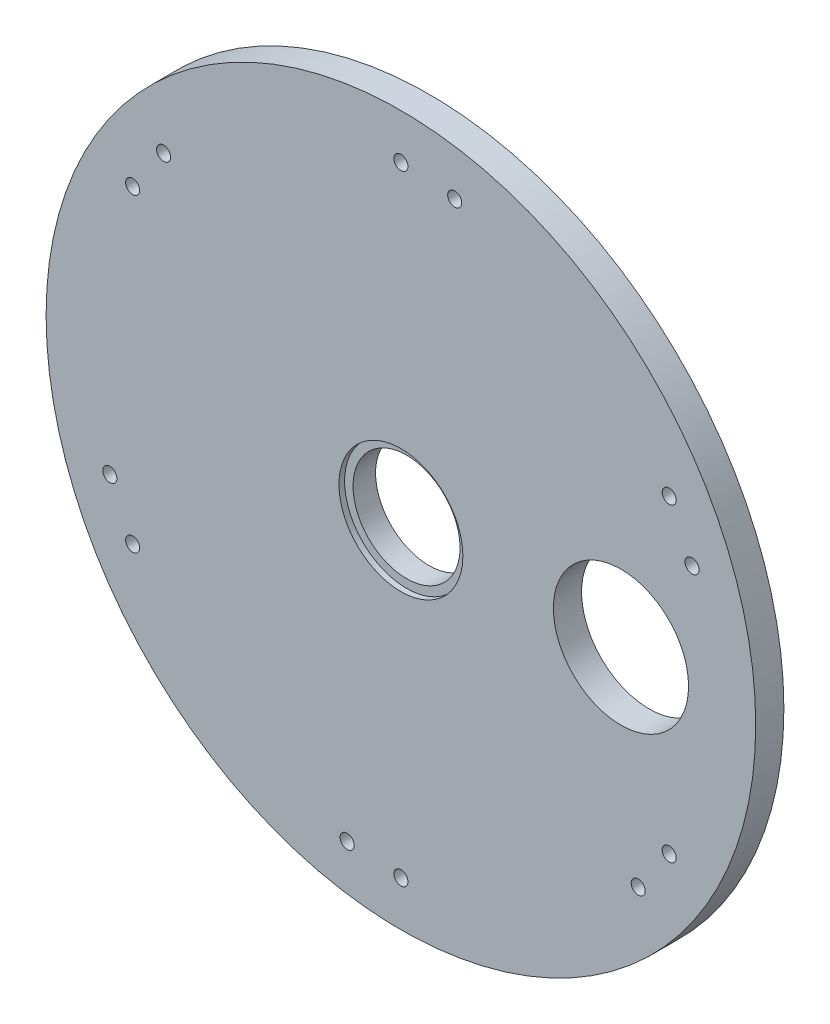
ISO-10303-21;
HEADER;
FILE_DESCRIPTION(('STEP AP214'),'2;1');
FILE_NAME('part.step','',(''),(''),'','','');
FILE_SCHEMA(('AUTOMOTIVE_DESIGN { 1 0 10303 214 1 1 1 1 }'));
ENDSEC;
DATA;
#1=APPLICATION_CONTEXT('core data for automotive mechanical design processes');
#2=APPLICATION_PROTOCOL_DEFINITION('international standard','automotive_design',2000,#1);
#3=PRODUCT_CONTEXT('',#1,'mechanical');
#4=PRODUCT('Part','Part','',(#3));
#5=PRODUCT_RELATED_PRODUCT_CATEGORY('part','',(#4));
#6=PRODUCT_DEFINITION_FORMATION('','',#4);
#7=PRODUCT_DEFINITION_CONTEXT('part definition',#1,'design');
#8=PRODUCT_DEFINITION('design','',#6,#7);
#9=PRODUCT_DEFINITION_SHAPE('','',#8);
#10=(LENGTH_UNIT() NAMED_UNIT(*) SI_UNIT(.MILLI.,.METRE.));
#11=(NAMED_UNIT(*) PLANE_ANGLE_UNIT() SI_UNIT($,.RADIAN.));
#12=(NAMED_UNIT(*) SI_UNIT($,.STERADIAN.) SOLID_ANGLE_UNIT());
#13=UNCERTAINTY_MEASURE_WITH_UNIT(LENGTH_MEASURE(1.E-05),#10,'distance_accuracy_value','');
#14=(GEOMETRIC_REPRESENTATION_CONTEXT(3) GLOBAL_UNCERTAINTY_ASSIGNED_CONTEXT((#13)) GLOBAL_UNIT_ASSIGNED_CONTEXT((#10,
#11,#12)) REPRESENTATION_CONTEXT('',''));
#15=CARTESIAN_POINT('',(0.,0.,0.));
#16=DIRECTION('',(0.,0.,1.));
#17=DIRECTION('',(1.,0.,0.));
#18=AXIS2_PLACEMENT_3D('',#15,#16,#17);
#19=CARTESIAN_POINT('',(0.,0.,-5.));
#20=DIRECTION('',(0.,0.,1.));
#21=DIRECTION('',(1.,0.,0.));
#22=AXIS2_PLACEMENT_3D('',#19,#20,#21);
#23=CYLINDRICAL_SURFACE('',#22,9.5);
#24=CARTESIAN_POINT('',(0.,0.,0.));
#25=DIRECTION('',(0.,0.,1.));
#26=DIRECTION('',(1.,0.,0.));
#27=AXIS2_PLACEMENT_3D('',#24,#25,#26);
#28=CIRCLE('',#27,9.5);
#29=CARTESIAN_POINT('',(9.5,0.,0.));
#30=VERTEX_POINT('',#29);
#31=EDGE_CURVE('E53',#30,#30,#28,.T.);
#32=ORIENTED_EDGE('',*,*,#31,.F.);
#33=EDGE_LOOP('',(#32));
#34=FACE_BOUND('',#33,.T.);
#35=CARTESIAN_POINT('',(0.,0.,4.));
#36=DIRECTION('',(0.,0.,1.));
#37=DIRECTION('',(1.,0.,0.));
#38=AXIS2_PLACEMENT_3D('',#35,#36,#37);
#39=CIRCLE('',#38,9.5);
#40=CARTESIAN_POINT('',(9.5,0.,4.));
#41=VERTEX_POINT('',#40);
#42=EDGE_CURVE('E39',#41,#41,#39,.F.);
#43=ORIENTED_EDGE('',*,*,#42,.F.);
#44=EDGE_LOOP('',(#43));
#45=FACE_BOUND('',#44,.T.);
#46=ADVANCED_FACE('F35',(#34,#45),#23,.F.);
#47=CARTESIAN_POINT('',(0.,0.,5.));
#48=DIRECTION('',(0.,0.,1.));
#49=DIRECTION('',(1.,0.,0.));
#50=AXIS2_PLACEMENT_3D('',#47,#48,#49);
#51=PLANE('',#50);
#52=CARTESIAN_POINT('',(0.,0.,5.));
#53=DIRECTION('',(0.,0.,1.));
#54=DIRECTION('',(1.,0.,0.));
#55=AXIS2_PLACEMENT_3D('',#52,#53,#54);
#56=CIRCLE('',#55,11.);
#57=CARTESIAN_POINT('',(11.,0.,5.));
#58=VERTEX_POINT('',#57);
#59=EDGE_CURVE('E66',#58,#58,#56,.T.);
#60=ORIENTED_EDGE('',*,*,#59,.F.);
#61=EDGE_LOOP('',(#60));
#62=FACE_BOUND('',#61,.T.);
#63=CARTESIAN_POINT('',(39.0730330186225,2.14002621070877E-10,5.));
#64=DIRECTION('',(0.,0.,1.));
#65=DIRECTION('',(1.,0.,0.));
#66=AXIS2_PLACEMENT_3D('',#63,#64,#65);
#67=CIRCLE('',#66,11.9999999996537);
#68=CARTESIAN_POINT('',(51.0730330182762,2.14002621070877E-10,5.));
#69=VERTEX_POINT('',#68);
#70=EDGE_CURVE('E55',#69,#69,#67,.T.);
#71=ORIENTED_EDGE('',*,*,#70,.F.);
#72=EDGE_LOOP('',(#71));
#73=FACE_BOUND('',#72,.T.);
#74=CARTESIAN_POINT('',(-9.55064977168123,-54.1644264156714,5.));
#75=DIRECTION('',(0.,0.,1.));
#76=DIRECTION('',(1.,0.,0.));
#77=AXIS2_PLACEMENT_3D('',#74,#75,#76);
#78=CIRCLE('',#77,1.25);
#79=CARTESIAN_POINT('',(-8.30064977168123,-54.1644264156714,5.));
#80=VERTEX_POINT('',#79);
#81=EDGE_CURVE('E82',#80,#80,#78,.T.);
#82=ORIENTED_EDGE('',*,*,#81,.F.);
#83=EDGE_LOOP('',(#82));
#84=FACE_BOUND('',#83,.T.);
#85=CARTESIAN_POINT('',(51.683094143225,18.8111078829117,5.));
#86=DIRECTION('',(0.,0.,1.));
#87=DIRECTION('',(1.,0.,0.));
#88=AXIS2_PLACEMENT_3D('',#85,#86,#87);
#89=CIRCLE('',#88,1.25);
#90=CARTESIAN_POINT('',(52.933094143225,18.8111078829117,5.));
#91=VERTEX_POINT('',#90);
#92=EDGE_CURVE('E94',#91,#91,#89,.T.);
#93=ORIENTED_EDGE('',*,*,#92,.F.);
#94=EDGE_LOOP('',(#93));
#95=FACE_BOUND('',#94,.T.);
#96=CARTESIAN_POINT('',(-47.6313972081441,27.5,5.));
#97=DIRECTION('',(0.,0.,1.));
#98=DIRECTION('',(1.,0.,0.));
#99=AXIS2_PLACEMENT_3D('',#96,#97,#98);
#100=CIRCLE('',#99,1.25);
#101=CARTESIAN_POINT('',(-46.3813972081441,27.5,5.));
#102=VERTEX_POINT('',#101);
#103=EDGE_CURVE('E106',#102,#102,#100,.T.);
#104=ORIENTED_EDGE('',*,*,#103,.F.);
#105=EDGE_LOOP('',(#104));
#106=FACE_BOUND('',#105,.T.);
#107=CARTESIAN_POINT('',(0.,-55.,5.));
#108=DIRECTION('',(0.,0.,1.));
#109=DIRECTION('',(1.,0.,0.));
#110=AXIS2_PLACEMENT_3D('',#107,#108,#109);
#111=CIRCLE('',#110,1.25);
#112=CARTESIAN_POINT('',(1.24999999999998,-55.,5.));
#113=VERTEX_POINT('',#112);
#114=EDGE_CURVE('E118',#113,#113,#111,.T.);
#115=ORIENTED_EDGE('',*,*,#114,.F.);
#116=EDGE_LOOP('',(#115));
#117=FACE_BOUND('',#116,.T.);
#118=CARTESIAN_POINT('',(47.6313972081441,27.5,5.));
#119=DIRECTION('',(0.,0.,1.));
#120=DIRECTION('',(1.,0.,0.));
#121=AXIS2_PLACEMENT_3D('',#118,#119,#120);
#122=CIRCLE('',#121,1.25);
#123=CARTESIAN_POINT('',(48.8813972081441,27.5,5.));
#124=VERTEX_POINT('',#123);
#125=EDGE_CURVE('E130',#124,#124,#122,.T.);
#126=ORIENTED_EDGE('',*,*,#125,.F.);
#127=EDGE_LOOP('',(#126));
#128=FACE_BOUND('',#127,.T.);
#129=CARTESIAN_POINT('',(0.,55.,5.));
#130=DIRECTION('',(0.,0.,1.));
#131=DIRECTION('',(1.,0.,0.));
#132=AXIS2_PLACEMENT_3D('',#129,#130,#131);
#133=CIRCLE('',#132,1.25);
#134=CARTESIAN_POINT('',(1.25000000000001,55.,5.));
#135=VERTEX_POINT('',#134);
#136=EDGE_CURVE('E48',#135,#135,#133,.T.);
#137=ORIENTED_EDGE('',*,*,#136,.F.);
#138=EDGE_LOOP('',(#137));
#139=FACE_BOUND('',#138,.T.);
#140=CARTESIAN_POINT('',(0.,0.,5.));
#141=DIRECTION('',(0.,0.,1.));
#142=DIRECTION('',(1.,0.,0.));
#143=AXIS2_PLACEMENT_3D('',#140,#141,#142);
#144=CIRCLE('',#143,63.);
#145=CARTESIAN_POINT('',(63.,0.,5.));
#146=VERTEX_POINT('',#145);
#147=EDGE_CURVE('E11',#146,#146,#144,.T.);
#148=ORIENTED_EDGE('',*,*,#147,.T.);
#149=EDGE_LOOP('',(#148));
#150=FACE_BOUND('',#149,.T.);
#151=CARTESIAN_POINT('',(-42.1324443715438,35.3533185327597,5.));
#152=DIRECTION('',(0.,0.,1.));
#153=DIRECTION('',(1.,0.,0.));
#154=AXIS2_PLACEMENT_3D('',#151,#152,#153);
#155=CIRCLE('',#154,1.25);
#156=CARTESIAN_POINT('',(-40.8824443715438,35.3533185327597,5.));
#157=VERTEX_POINT('',#156);
#158=EDGE_CURVE('E136',#157,#157,#155,.T.);
#159=ORIENTED_EDGE('',*,*,#158,.F.);
#160=EDGE_LOOP('',(#159));
#161=FACE_BOUND('',#160,.T.);
#162=CARTESIAN_POINT('',(47.6313972081441,-27.5,5.));
#163=DIRECTION('',(0.,0.,1.));
#164=DIRECTION('',(1.,0.,0.));
#165=AXIS2_PLACEMENT_3D('',#162,#163,#164);
#166=CIRCLE('',#165,1.25);
#167=CARTESIAN_POINT('',(48.8813972081441,-27.5,5.));
#168=VERTEX_POINT('',#167);
#169=EDGE_CURVE('E124',#168,#168,#166,.T.);
#170=ORIENTED_EDGE('',*,*,#169,.F.);
#171=EDGE_LOOP('',(#170));
#172=FACE_BOUND('',#171,.T.);
#173=CARTESIAN_POINT('',(-47.6313972081441,-27.5,5.));
#174=DIRECTION('',(0.,0.,1.));
#175=DIRECTION('',(1.,0.,0.));
#176=AXIS2_PLACEMENT_3D('',#173,#174,#175);
#177=CIRCLE('',#176,1.25);
#178=CARTESIAN_POINT('',(-46.3813972081441,-27.5,5.));
#179=VERTEX_POINT('',#178);
#180=EDGE_CURVE('E112',#179,#179,#177,.T.);
#181=ORIENTED_EDGE('',*,*,#180,.F.);
#182=EDGE_LOOP('',(#181));
#183=FACE_BOUND('',#182,.T.);
#184=CARTESIAN_POINT('',(9.55064977168123,54.1644264156714,5.));
#185=DIRECTION('',(0.,0.,1.));
#186=DIRECTION('',(1.,0.,0.));
#187=AXIS2_PLACEMENT_3D('',#184,#185,#186);
#188=CIRCLE('',#187,1.25);
#189=CARTESIAN_POINT('',(10.8006497716812,54.1644264156714,5.));
#190=VERTEX_POINT('',#189);
#191=EDGE_CURVE('E100',#190,#190,#188,.T.);
#192=ORIENTED_EDGE('',*,*,#191,.F.);
#193=EDGE_LOOP('',(#192));
#194=FACE_BOUND('',#193,.T.);
#195=CARTESIAN_POINT('',(42.1324443715438,-35.3533185327597,5.));
#196=DIRECTION('',(0.,0.,1.));
#197=DIRECTION('',(1.,0.,0.));
#198=AXIS2_PLACEMENT_3D('',#195,#196,#197);
#199=CIRCLE('',#198,1.25);
#200=CARTESIAN_POINT('',(43.3824443715438,-35.3533185327597,5.));
#201=VERTEX_POINT('',#200);
#202=EDGE_CURVE('E88',#201,#201,#199,.T.);
#203=ORIENTED_EDGE('',*,*,#202,.F.);
#204=EDGE_LOOP('',(#203));
#205=FACE_BOUND('',#204,.T.);
#206=CARTESIAN_POINT('',(-51.683094143225,-18.8111078829117,5.));
#207=DIRECTION('',(0.,0.,1.));
#208=DIRECTION('',(1.,0.,0.));
#209=AXIS2_PLACEMENT_3D('',#206,#207,#208);
#210=CIRCLE('',#209,1.25);
#211=CARTESIAN_POINT('',(-50.433094143225,-18.8111078829117,5.));
#212=VERTEX_POINT('',#211);
#213=EDGE_CURVE('E76',#212,#212,#210,.T.);
#214=ORIENTED_EDGE('',*,*,#213,.F.);
#215=EDGE_LOOP('',(#214));
#216=FACE_BOUND('',#215,.T.);
#217=ADVANCED_FACE('F163',(#62,#73,#84,#95,#106,#117,#128,#139,#150,#161,#172,#183,#194,#205,
#216),#51,.T.);
#218=CARTESIAN_POINT('',(0.,0.,0.));
#219=DIRECTION('',(0.,0.,1.));
#220=DIRECTION('',(1.,0.,0.));
#221=AXIS2_PLACEMENT_3D('',#218,#219,#220);
#222=PLANE('',#221);
#223=ORIENTED_EDGE('',*,*,#31,.T.);
#224=EDGE_LOOP('',(#223));
#225=FACE_BOUND('',#224,.T.);
#226=CARTESIAN_POINT('',(39.0730330186225,2.14002621070877E-10,0.));
#227=DIRECTION('',(0.,0.,1.));
#228=DIRECTION('',(1.,0.,0.));
#229=AXIS2_PLACEMENT_3D('',#226,#227,#228);
#230=CIRCLE('',#229,11.9999999996537);
#231=CARTESIAN_POINT('',(51.0730330182762,2.14002621070877E-10,0.));
#232=VERTEX_POINT('',#231);
#233=EDGE_CURVE('E59',#232,#232,#230,.T.);
#234=ORIENTED_EDGE('',*,*,#233,.T.);
#235=EDGE_LOOP('',(#234));
#236=FACE_BOUND('',#235,.T.);
#237=CARTESIAN_POINT('',(0.,0.,0.));
#238=DIRECTION('',(0.,0.,1.));
#239=DIRECTION('',(1.,0.,0.));
#240=AXIS2_PLACEMENT_3D('',#237,#238,#239);
#241=CIRCLE('',#240,63.);
#242=CARTESIAN_POINT('',(63.,0.,0.));
#243=VERTEX_POINT('',#242);
#244=EDGE_CURVE('E43',#243,#243,#241,.T.);
#245=ORIENTED_EDGE('',*,*,#244,.F.);
#246=EDGE_LOOP('',(#245));
#247=FACE_BOUND('',#246,.T.);
#248=CARTESIAN_POINT('',(0.,55.,0.));
#249=DIRECTION('',(0.,0.,1.));
#250=DIRECTION('',(1.,0.,0.));
#251=AXIS2_PLACEMENT_3D('',#248,#249,#250);
#252=CIRCLE('',#251,1.25);
#253=CARTESIAN_POINT('',(1.25000000000001,55.,0.));
#254=VERTEX_POINT('',#253);
#255=EDGE_CURVE('E51',#254,#254,#252,.T.);
#256=ORIENTED_EDGE('',*,*,#255,.T.);
#257=EDGE_LOOP('',(#256));
#258=FACE_BOUND('',#257,.T.);
#259=CARTESIAN_POINT('',(-42.1324443715438,35.3533185327597,0.));
#260=DIRECTION('',(0.,0.,1.));
#261=DIRECTION('',(1.,0.,0.));
#262=AXIS2_PLACEMENT_3D('',#259,#260,#261);
#263=CIRCLE('',#262,1.25);
#264=CARTESIAN_POINT('',(-40.8824443715438,35.3533185327597,0.));
#265=VERTEX_POINT('',#264);
#266=EDGE_CURVE('E133',#265,#265,#263,.T.);
#267=ORIENTED_EDGE('',*,*,#266,.T.);
#268=EDGE_LOOP('',(#267));
#269=FACE_BOUND('',#268,.T.);
#270=CARTESIAN_POINT('',(47.6313972081441,27.5,0.));
#271=DIRECTION('',(0.,0.,1.));
#272=DIRECTION('',(1.,0.,0.));
#273=AXIS2_PLACEMENT_3D('',#270,#271,#272);
#274=CIRCLE('',#273,1.25);
#275=CARTESIAN_POINT('',(48.8813972081441,27.5,0.));
#276=VERTEX_POINT('',#275);
#277=EDGE_CURVE('E127',#276,#276,#274,.T.);
#278=ORIENTED_EDGE('',*,*,#277,.T.);
#279=EDGE_LOOP('',(#278));
#280=FACE_BOUND('',#279,.T.);
#281=CARTESIAN_POINT('',(47.6313972081441,-27.5,0.));
#282=DIRECTION('',(0.,0.,1.));
#283=DIRECTION('',(1.,0.,0.));
#284=AXIS2_PLACEMENT_3D('',#281,#282,#283);
#285=CIRCLE('',#284,1.25);
#286=CARTESIAN_POINT('',(48.8813972081441,-27.5,0.));
#287=VERTEX_POINT('',#286);
#288=EDGE_CURVE('E121',#287,#287,#285,.T.);
#289=ORIENTED_EDGE('',*,*,#288,.T.);
#290=EDGE_LOOP('',(#289));
#291=FACE_BOUND('',#290,.T.);
#292=CARTESIAN_POINT('',(0.,-55.,0.));
#293=DIRECTION('',(0.,0.,1.));
#294=DIRECTION('',(1.,0.,0.));
#295=AXIS2_PLACEMENT_3D('',#292,#293,#294);
#296=CIRCLE('',#295,1.25);
#297=CARTESIAN_POINT('',(1.24999999999998,-55.,0.));
#298=VERTEX_POINT('',#297);
#299=EDGE_CURVE('E115',#298,#298,#296,.T.);
#300=ORIENTED_EDGE('',*,*,#299,.T.);
#301=EDGE_LOOP('',(#300));
#302=FACE_BOUND('',#301,.T.);
#303=CARTESIAN_POINT('',(-47.6313972081441,-27.5,0.));
#304=DIRECTION('',(0.,0.,1.));
#305=DIRECTION('',(1.,0.,0.));
#306=AXIS2_PLACEMENT_3D('',#303,#304,#305);
#307=CIRCLE('',#306,1.25);
#308=CARTESIAN_POINT('',(-46.3813972081441,-27.5,0.));
#309=VERTEX_POINT('',#308);
#310=EDGE_CURVE('E109',#309,#309,#307,.T.);
#311=ORIENTED_EDGE('',*,*,#310,.T.);
#312=EDGE_LOOP('',(#311));
#313=FACE_BOUND('',#312,.T.);
#314=CARTESIAN_POINT('',(-47.6313972081441,27.5,0.));
#315=DIRECTION('',(0.,0.,1.));
#316=DIRECTION('',(1.,0.,0.));
#317=AXIS2_PLACEMENT_3D('',#314,#315,#316);
#318=CIRCLE('',#317,1.25);
#319=CARTESIAN_POINT('',(-46.3813972081441,27.5,0.));
#320=VERTEX_POINT('',#319);
#321=EDGE_CURVE('E103',#320,#320,#318,.T.);
#322=ORIENTED_EDGE('',*,*,#321,.T.);
#323=EDGE_LOOP('',(#322));
#324=FACE_BOUND('',#323,.T.);
#325=CARTESIAN_POINT('',(9.55064977168123,54.1644264156714,0.));
#326=DIRECTION('',(0.,0.,1.));
#327=DIRECTION('',(1.,0.,0.));
#328=AXIS2_PLACEMENT_3D('',#325,#326,#327);
#329=CIRCLE('',#328,1.25);
#330=CARTESIAN_POINT('',(10.8006497716812,54.1644264156714,0.));
#331=VERTEX_POINT('',#330);
#332=EDGE_CURVE('E97',#331,#331,#329,.T.);
#333=ORIENTED_EDGE('',*,*,#332,.T.);
#334=EDGE_LOOP('',(#333));
#335=FACE_BOUND('',#334,.T.);
#336=CARTESIAN_POINT('',(51.683094143225,18.8111078829117,0.));
#337=DIRECTION('',(0.,0.,1.));
#338=DIRECTION('',(1.,0.,0.));
#339=AXIS2_PLACEMENT_3D('',#336,#337,#338);
#340=CIRCLE('',#339,1.25);
#341=CARTESIAN_POINT('',(52.933094143225,18.8111078829117,0.));
#342=VERTEX_POINT('',#341);
#343=EDGE_CURVE('E91',#342,#342,#340,.T.);
#344=ORIENTED_EDGE('',*,*,#343,.T.);
#345=EDGE_LOOP('',(#344));
#346=FACE_BOUND('',#345,.T.);
#347=CARTESIAN_POINT('',(42.1324443715438,-35.3533185327597,0.));
#348=DIRECTION('',(0.,0.,1.));
#349=DIRECTION('',(1.,0.,0.));
#350=AXIS2_PLACEMENT_3D('',#347,#348,#349);
#351=CIRCLE('',#350,1.25);
#352=CARTESIAN_POINT('',(43.3824443715438,-35.3533185327597,0.));
#353=VERTEX_POINT('',#352);
#354=EDGE_CURVE('E85',#353,#353,#351,.T.);
#355=ORIENTED_EDGE('',*,*,#354,.T.);
#356=EDGE_LOOP('',(#355));
#357=FACE_BOUND('',#356,.T.);
#358=CARTESIAN_POINT('',(-9.55064977168123,-54.1644264156714,0.));
#359=DIRECTION('',(0.,0.,1.));
#360=DIRECTION('',(1.,0.,0.));
#361=AXIS2_PLACEMENT_3D('',#358,#359,#360);
#362=CIRCLE('',#361,1.25);
#363=CARTESIAN_POINT('',(-8.30064977168123,-54.1644264156714,0.));
#364=VERTEX_POINT('',#363);
#365=EDGE_CURVE('E79',#364,#364,#362,.T.);
#366=ORIENTED_EDGE('',*,*,#365,.T.);
#367=EDGE_LOOP('',(#366));
#368=FACE_BOUND('',#367,.T.);
#369=CARTESIAN_POINT('',(-51.683094143225,-18.8111078829117,0.));
#370=DIRECTION('',(0.,0.,1.));
#371=DIRECTION('',(1.,0.,0.));
#372=AXIS2_PLACEMENT_3D('',#369,#370,#371);
#373=CIRCLE('',#372,1.25);
#374=CARTESIAN_POINT('',(-50.433094143225,-18.8111078829117,0.));
#375=VERTEX_POINT('',#374);
#376=EDGE_CURVE('E74',#375,#375,#373,.T.);
#377=ORIENTED_EDGE('',*,*,#376,.T.);
#378=EDGE_LOOP('',(#377));
#379=FACE_BOUND('',#378,.T.);
#380=ADVANCED_FACE('F146',(#225,#236,#247,#258,#269,#280,#291,#302,#313,#324,#335,#346,#357,
#368,#379),#222,.F.);
#381=CARTESIAN_POINT('',(0.,0.,5.));
#382=DIRECTION('',(0.,0.,-1.));
#383=DIRECTION('',(-1.,0.,0.));
#384=AXIS2_PLACEMENT_3D('',#381,#382,#383);
#385=CYLINDRICAL_SURFACE('',#384,63.);
#386=ORIENTED_EDGE('',*,*,#147,.F.);
#387=EDGE_LOOP('',(#386));
#388=FACE_BOUND('',#387,.T.);
#389=ORIENTED_EDGE('',*,*,#244,.T.);
#390=EDGE_LOOP('',(#389));
#391=FACE_BOUND('',#390,.T.);
#392=ADVANCED_FACE('F37',(#388,#391),#385,.T.);
#393=CARTESIAN_POINT('',(0.,55.,5.));
#394=DIRECTION('',(0.,0.,-1.));
#395=DIRECTION('',(-1.,0.,0.));
#396=AXIS2_PLACEMENT_3D('',#393,#394,#395);
#397=CYLINDRICAL_SURFACE('',#396,1.25);
#398=ORIENTED_EDGE('',*,*,#136,.T.);
#399=EDGE_LOOP('',(#398));
#400=FACE_BOUND('',#399,.T.);
#401=ORIENTED_EDGE('',*,*,#255,.F.);
#402=EDGE_LOOP('',(#401));
#403=FACE_BOUND('',#402,.T.);
#404=ADVANCED_FACE('F149',(#400,#403),#397,.F.);
#405=CARTESIAN_POINT('',(-42.1324443715438,35.3533185327597,5.));
#406=DIRECTION('',(0.,0.,-1.));
#407=DIRECTION('',(-1.,0.,0.));
#408=AXIS2_PLACEMENT_3D('',#405,#406,#407);
#409=CYLINDRICAL_SURFACE('',#408,1.25);
#410=ORIENTED_EDGE('',*,*,#158,.T.);
#411=EDGE_LOOP('',(#410));
#412=FACE_BOUND('',#411,.T.);
#413=ORIENTED_EDGE('',*,*,#266,.F.);
#414=EDGE_LOOP('',(#413));
#415=FACE_BOUND('',#414,.T.);
#416=ADVANCED_FACE('F151',(#412,#415),#409,.F.);
#417=CARTESIAN_POINT('',(47.6313972081441,27.5,5.));
#418=DIRECTION('',(0.,0.,-1.));
#419=DIRECTION('',(-1.,0.,0.));
#420=AXIS2_PLACEMENT_3D('',#417,#418,#419);
#421=CYLINDRICAL_SURFACE('',#420,1.25);
#422=ORIENTED_EDGE('',*,*,#125,.T.);
#423=EDGE_LOOP('',(#422));
#424=FACE_BOUND('',#423,.T.);
#425=ORIENTED_EDGE('',*,*,#277,.F.);
#426=EDGE_LOOP('',(#425));
#427=FACE_BOUND('',#426,.T.);
#428=ADVANCED_FACE('F157',(#424,#427),#421,.F.);
#429=CARTESIAN_POINT('',(47.6313972081441,-27.5,5.));
#430=DIRECTION('',(0.,0.,-1.));
#431=DIRECTION('',(-1.,0.,0.));
#432=AXIS2_PLACEMENT_3D('',#429,#430,#431);
#433=CYLINDRICAL_SURFACE('',#432,1.25);
#434=ORIENTED_EDGE('',*,*,#169,.T.);
#435=EDGE_LOOP('',(#434));
#436=FACE_BOUND('',#435,.T.);
#437=ORIENTED_EDGE('',*,*,#288,.F.);
#438=EDGE_LOOP('',(#437));
#439=FACE_BOUND('',#438,.T.);
#440=ADVANCED_FACE('F211',(#436,#439),#433,.F.);
#441=CARTESIAN_POINT('',(0.,-55.,5.));
#442=DIRECTION('',(0.,0.,-1.));
#443=DIRECTION('',(-1.,0.,0.));
#444=AXIS2_PLACEMENT_3D('',#441,#442,#443);
#445=CYLINDRICAL_SURFACE('',#444,1.25);
#446=ORIENTED_EDGE('',*,*,#114,.T.);
#447=EDGE_LOOP('',(#446));
#448=FACE_BOUND('',#447,.T.);
#449=ORIENTED_EDGE('',*,*,#299,.F.);
#450=EDGE_LOOP('',(#449));
#451=FACE_BOUND('',#450,.T.);
#452=ADVANCED_FACE('F207',(#448,#451),#445,.F.);
#453=CARTESIAN_POINT('',(-47.6313972081441,-27.5,5.));
#454=DIRECTION('',(0.,0.,-1.));
#455=DIRECTION('',(-1.,0.,0.));
#456=AXIS2_PLACEMENT_3D('',#453,#454,#455);
#457=CYLINDRICAL_SURFACE('',#456,1.25);
#458=ORIENTED_EDGE('',*,*,#180,.T.);
#459=EDGE_LOOP('',(#458));
#460=FACE_BOUND('',#459,.T.);
#461=ORIENTED_EDGE('',*,*,#310,.F.);
#462=EDGE_LOOP('',(#461));
#463=FACE_BOUND('',#462,.T.);
#464=ADVANCED_FACE('F203',(#460,#463),#457,.F.);
#465=CARTESIAN_POINT('',(-47.6313972081441,27.5,5.));
#466=DIRECTION('',(0.,0.,-1.));
#467=DIRECTION('',(-1.,0.,0.));
#468=AXIS2_PLACEMENT_3D('',#465,#466,#467);
#469=CYLINDRICAL_SURFACE('',#468,1.25);
#470=ORIENTED_EDGE('',*,*,#103,.T.);
#471=EDGE_LOOP('',(#470));
#472=FACE_BOUND('',#471,.T.);
#473=ORIENTED_EDGE('',*,*,#321,.F.);
#474=EDGE_LOOP('',(#473));
#475=FACE_BOUND('',#474,.T.);
#476=ADVANCED_FACE('F199',(#472,#475),#469,.F.);
#477=CARTESIAN_POINT('',(9.55064977168123,54.1644264156714,5.));
#478=DIRECTION('',(0.,0.,-1.));
#479=DIRECTION('',(-1.,0.,0.));
#480=AXIS2_PLACEMENT_3D('',#477,#478,#479);
#481=CYLINDRICAL_SURFACE('',#480,1.25);
#482=ORIENTED_EDGE('',*,*,#191,.T.);
#483=EDGE_LOOP('',(#482));
#484=FACE_BOUND('',#483,.T.);
#485=ORIENTED_EDGE('',*,*,#332,.F.);
#486=EDGE_LOOP('',(#485));
#487=FACE_BOUND('',#486,.T.);
#488=ADVANCED_FACE('F195',(#484,#487),#481,.F.);
#489=CARTESIAN_POINT('',(51.683094143225,18.8111078829117,5.));
#490=DIRECTION('',(0.,0.,-1.));
#491=DIRECTION('',(-1.,0.,0.));
#492=AXIS2_PLACEMENT_3D('',#489,#490,#491);
#493=CYLINDRICAL_SURFACE('',#492,1.25);
#494=ORIENTED_EDGE('',*,*,#92,.T.);
#495=EDGE_LOOP('',(#494));
#496=FACE_BOUND('',#495,.T.);
#497=ORIENTED_EDGE('',*,*,#343,.F.);
#498=EDGE_LOOP('',(#497));
#499=FACE_BOUND('',#498,.T.);
#500=ADVANCED_FACE('F191',(#496,#499),#493,.F.);
#501=CARTESIAN_POINT('',(42.1324443715438,-35.3533185327597,5.));
#502=DIRECTION('',(0.,0.,-1.));
#503=DIRECTION('',(-1.,0.,0.));
#504=AXIS2_PLACEMENT_3D('',#501,#502,#503);
#505=CYLINDRICAL_SURFACE('',#504,1.25);
#506=ORIENTED_EDGE('',*,*,#202,.T.);
#507=EDGE_LOOP('',(#506));
#508=FACE_BOUND('',#507,.T.);
#509=ORIENTED_EDGE('',*,*,#354,.F.);
#510=EDGE_LOOP('',(#509));
#511=FACE_BOUND('',#510,.T.);
#512=ADVANCED_FACE('F187',(#508,#511),#505,.F.);
#513=CARTESIAN_POINT('',(-9.55064977168123,-54.1644264156714,5.));
#514=DIRECTION('',(0.,0.,-1.));
#515=DIRECTION('',(-1.,0.,0.));
#516=AXIS2_PLACEMENT_3D('',#513,#514,#515);
#517=CYLINDRICAL_SURFACE('',#516,1.25);
#518=ORIENTED_EDGE('',*,*,#81,.T.);
#519=EDGE_LOOP('',(#518));
#520=FACE_BOUND('',#519,.T.);
#521=ORIENTED_EDGE('',*,*,#365,.F.);
#522=EDGE_LOOP('',(#521));
#523=FACE_BOUND('',#522,.T.);
#524=ADVANCED_FACE('F183',(#520,#523),#517,.F.);
#525=CARTESIAN_POINT('',(-51.683094143225,-18.8111078829117,5.));
#526=DIRECTION('',(0.,0.,-1.));
#527=DIRECTION('',(-1.,0.,0.));
#528=AXIS2_PLACEMENT_3D('',#525,#526,#527);
#529=CYLINDRICAL_SURFACE('',#528,1.25);
#530=ORIENTED_EDGE('',*,*,#213,.T.);
#531=EDGE_LOOP('',(#530));
#532=FACE_BOUND('',#531,.T.);
#533=ORIENTED_EDGE('',*,*,#376,.F.);
#534=EDGE_LOOP('',(#533));
#535=FACE_BOUND('',#534,.T.);
#536=ADVANCED_FACE('F179',(#532,#535),#529,.F.);
#537=CARTESIAN_POINT('',(39.0730330186225,2.14002621070877E-10,0.));
#538=DIRECTION('',(0.,0.,1.));
#539=DIRECTION('',(1.,0.,0.));
#540=AXIS2_PLACEMENT_3D('',#537,#538,#539);
#541=CYLINDRICAL_SURFACE('',#540,11.9999999996537);
#542=ORIENTED_EDGE('',*,*,#233,.F.);
#543=EDGE_LOOP('',(#542));
#544=FACE_BOUND('',#543,.T.);
#545=ORIENTED_EDGE('',*,*,#70,.T.);
#546=EDGE_LOOP('',(#545));
#547=FACE_BOUND('',#546,.T.);
#548=ADVANCED_FACE('F175',(#544,#547),#541,.F.);
#549=CARTESIAN_POINT('',(0.,0.,4.));
#550=DIRECTION('',(0.,0.,1.));
#551=DIRECTION('',(1.,0.,0.));
#552=AXIS2_PLACEMENT_3D('',#549,#550,#551);
#553=PLANE('',#552);
#554=CARTESIAN_POINT('',(0.,0.,4.));
#555=DIRECTION('',(0.,0.,1.));
#556=DIRECTION('',(1.,0.,0.));
#557=AXIS2_PLACEMENT_3D('',#554,#555,#556);
#558=CIRCLE('',#557,11.);
#559=CARTESIAN_POINT('',(11.,0.,4.));
#560=VERTEX_POINT('',#559);
#561=EDGE_CURVE('E62',#560,#560,#558,.T.);
#562=ORIENTED_EDGE('',*,*,#561,.T.);
#563=EDGE_LOOP('',(#562));
#564=FACE_BOUND('',#563,.T.);
#565=ORIENTED_EDGE('',*,*,#42,.T.);
#566=EDGE_LOOP('',(#565));
#567=FACE_BOUND('',#566,.T.);
#568=ADVANCED_FACE('F178',(#564,#567),#553,.T.);
#569=CARTESIAN_POINT('',(0.,0.,4.));
#570=DIRECTION('',(0.,0.,1.));
#571=DIRECTION('',(1.,0.,0.));
#572=AXIS2_PLACEMENT_3D('',#569,#570,#571);
#573=CYLINDRICAL_SURFACE('',#572,11.);
#574=ORIENTED_EDGE('',*,*,#561,.F.);
#575=EDGE_LOOP('',(#574));
#576=FACE_BOUND('',#575,.T.);
#577=ORIENTED_EDGE('',*,*,#59,.T.);
#578=EDGE_LOOP('',(#577));
#579=FACE_BOUND('',#578,.T.);
#580=ADVANCED_FACE('F173',(#576,#579),#573,.F.);
#581=CLOSED_SHELL('',(#46,#217,#380,#392,#404,#416,#428,#440,#452,#464,#476,#488,#500,#512,#524,
#536,#548,#568,#580));
#582=MANIFOLD_SOLID_BREP('B2',#581);
#583=ADVANCED_BREP_SHAPE_REPRESENTATION('',(#18,#582),#14);
#584=SHAPE_DEFINITION_REPRESENTATION(#9,#583);
ENDSEC;
END-ISO-10303-21;
